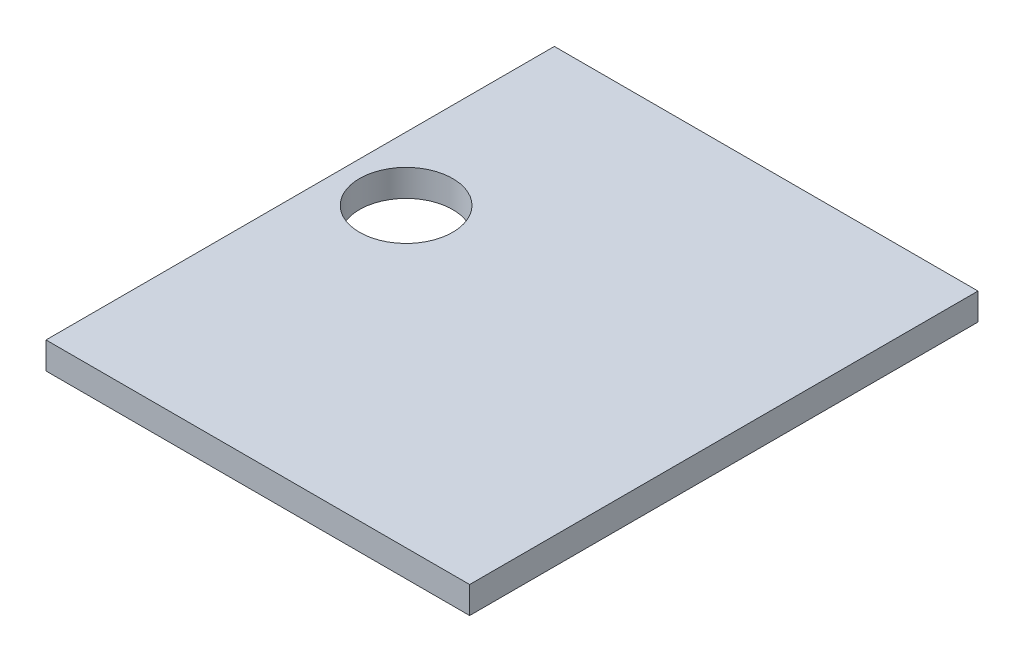
ISO-10303-21;
HEADER;
FILE_DESCRIPTION(('STEP AP214'),'2;1');
FILE_NAME('part.step','',(''),(''),'','','');
FILE_SCHEMA(('AUTOMOTIVE_DESIGN { 1 0 10303 214 1 1 1 1 }'));
ENDSEC;
DATA;
#1=APPLICATION_CONTEXT('core data for automotive mechanical design processes');
#2=APPLICATION_PROTOCOL_DEFINITION('international standard','automotive_design',2000,#1);
#3=PRODUCT_CONTEXT('',#1,'mechanical');
#4=PRODUCT('Part','Part','',(#3));
#5=PRODUCT_RELATED_PRODUCT_CATEGORY('part','',(#4));
#6=PRODUCT_DEFINITION_FORMATION('','',#4);
#7=PRODUCT_DEFINITION_CONTEXT('part definition',#1,'design');
#8=PRODUCT_DEFINITION('design','',#6,#7);
#9=PRODUCT_DEFINITION_SHAPE('','',#8);
#10=(LENGTH_UNIT() NAMED_UNIT(*) SI_UNIT(.MILLI.,.METRE.));
#11=(NAMED_UNIT(*) PLANE_ANGLE_UNIT() SI_UNIT($,.RADIAN.));
#12=(NAMED_UNIT(*) SI_UNIT($,.STERADIAN.) SOLID_ANGLE_UNIT());
#13=UNCERTAINTY_MEASURE_WITH_UNIT(LENGTH_MEASURE(1.E-05),#10,'distance_accuracy_value','');
#14=(GEOMETRIC_REPRESENTATION_CONTEXT(3) GLOBAL_UNCERTAINTY_ASSIGNED_CONTEXT((#13)) GLOBAL_UNIT_ASSIGNED_CONTEXT((#10,
#11,#12)) REPRESENTATION_CONTEXT('',''));
#15=CARTESIAN_POINT('',(0.,0.,0.));
#16=DIRECTION('',(0.,0.,1.));
#17=DIRECTION('',(1.,0.,0.));
#18=AXIS2_PLACEMENT_3D('',#15,#16,#17);
#19=CARTESIAN_POINT('',(0.,6.35,0.));
#20=DIRECTION('',(0.,-1.,0.));
#21=DIRECTION('',(0.,0.,-1.));
#22=AXIS2_PLACEMENT_3D('',#19,#20,#21);
#23=PLANE('',#22);
#24=DIRECTION('',(0.,0.,1.));
#25=VECTOR('',#24,1.);
#26=CARTESIAN_POINT('',(0.,6.35,0.));
#27=LINE('',#26,#25);
#28=CARTESIAN_POINT('',(0.,6.35,-120.));
#29=VERTEX_POINT('',#28);
#30=CARTESIAN_POINT('',(0.,6.35,0.));
#31=VERTEX_POINT('',#30);
#32=EDGE_CURVE('E85',#29,#31,#27,.T.);
#33=ORIENTED_EDGE('',*,*,#32,.T.);
#34=DIRECTION('',(1.,0.,0.));
#35=VECTOR('',#34,1.);
#36=CARTESIAN_POINT('',(0.,6.35,0.));
#37=LINE('',#36,#35);
#38=CARTESIAN_POINT('',(100.,6.35,0.));
#39=VERTEX_POINT('',#38);
#40=EDGE_CURVE('E80',#31,#39,#37,.T.);
#41=ORIENTED_EDGE('',*,*,#40,.T.);
#42=DIRECTION('',(0.,0.,-1.));
#43=VECTOR('',#42,1.);
#44=CARTESIAN_POINT('',(100.,6.35,0.));
#45=LINE('',#44,#43);
#46=CARTESIAN_POINT('',(100.,6.35,-120.));
#47=VERTEX_POINT('',#46);
#48=EDGE_CURVE('E83',#39,#47,#45,.T.);
#49=ORIENTED_EDGE('',*,*,#48,.T.);
#50=DIRECTION('',(-1.,0.,0.));
#51=VECTOR('',#50,1.);
#52=CARTESIAN_POINT('',(0.,6.35,-120.));
#53=LINE('',#52,#51);
#54=EDGE_CURVE('E50',#47,#29,#53,.T.);
#55=ORIENTED_EDGE('',*,*,#54,.T.);
#56=EDGE_LOOP('',(#33,#41,#49,#55));
#57=FACE_BOUND('',#56,.T.);
#58=CARTESIAN_POINT('',(15.,6.35,-70.));
#59=DIRECTION('',(0.,1.,0.));
#60=DIRECTION('',(0.,0.,1.));
#61=AXIS2_PLACEMENT_3D('',#58,#59,#60);
#62=CIRCLE('',#61,11.);
#63=CARTESIAN_POINT('',(15.,6.35,-59.));
#64=VERTEX_POINT('',#63);
#65=EDGE_CURVE('E100',#64,#64,#62,.T.);
#66=ORIENTED_EDGE('',*,*,#65,.F.);
#67=EDGE_LOOP('',(#66));
#68=FACE_BOUND('',#67,.T.);
#69=ADVANCED_FACE('F33',(#57,#68),#23,.F.);
#70=CARTESIAN_POINT('',(0.,0.,0.));
#71=DIRECTION('',(0.,-1.,0.));
#72=DIRECTION('',(0.,0.,-1.));
#73=AXIS2_PLACEMENT_3D('',#70,#71,#72);
#74=PLANE('',#73);
#75=DIRECTION('',(0.,0.,1.));
#76=VECTOR('',#75,1.);
#77=CARTESIAN_POINT('',(0.,0.,0.));
#78=LINE('',#77,#76);
#79=CARTESIAN_POINT('',(0.,0.,-120.));
#80=VERTEX_POINT('',#79);
#81=CARTESIAN_POINT('',(0.,0.,0.));
#82=VERTEX_POINT('',#81);
#83=EDGE_CURVE('E97',#80,#82,#78,.T.);
#84=ORIENTED_EDGE('',*,*,#83,.F.);
#85=DIRECTION('',(-1.,0.,0.));
#86=VECTOR('',#85,1.);
#87=CARTESIAN_POINT('',(0.,0.,-120.));
#88=LINE('',#87,#86);
#89=CARTESIAN_POINT('',(100.,0.,-120.));
#90=VERTEX_POINT('',#89);
#91=EDGE_CURVE('E73',#90,#80,#88,.T.);
#92=ORIENTED_EDGE('',*,*,#91,.F.);
#93=DIRECTION('',(0.,0.,-1.));
#94=VECTOR('',#93,1.);
#95=CARTESIAN_POINT('',(100.,0.,0.));
#96=LINE('',#95,#94);
#97=CARTESIAN_POINT('',(100.,0.,0.));
#98=VERTEX_POINT('',#97);
#99=EDGE_CURVE('E67',#98,#90,#96,.T.);
#100=ORIENTED_EDGE('',*,*,#99,.F.);
#101=DIRECTION('',(1.,0.,0.));
#102=VECTOR('',#101,1.);
#103=CARTESIAN_POINT('',(0.,0.,0.));
#104=LINE('',#103,#102);
#105=EDGE_CURVE('E89',#82,#98,#104,.T.);
#106=ORIENTED_EDGE('',*,*,#105,.F.);
#107=EDGE_LOOP('',(#84,#92,#100,#106));
#108=FACE_BOUND('',#107,.T.);
#109=CARTESIAN_POINT('',(15.,0.,-70.));
#110=DIRECTION('',(0.,1.,0.));
#111=DIRECTION('',(0.,0.,1.));
#112=AXIS2_PLACEMENT_3D('',#109,#110,#111);
#113=CIRCLE('',#112,11.);
#114=CARTESIAN_POINT('',(15.,0.,-59.));
#115=VERTEX_POINT('',#114);
#116=EDGE_CURVE('E112',#115,#115,#113,.T.);
#117=ORIENTED_EDGE('',*,*,#116,.T.);
#118=EDGE_LOOP('',(#117));
#119=FACE_BOUND('',#118,.T.);
#120=ADVANCED_FACE('F108',(#108,#119),#74,.T.);
#121=CARTESIAN_POINT('',(0.,6.35,0.));
#122=DIRECTION('',(1.,0.,0.));
#123=DIRECTION('',(0.,0.,-1.));
#124=AXIS2_PLACEMENT_3D('',#121,#122,#123);
#125=PLANE('',#124);
#126=ORIENTED_EDGE('',*,*,#83,.T.);
#127=DIRECTION('',(0.,-1.,0.));
#128=VECTOR('',#127,1.);
#129=CARTESIAN_POINT('',(0.,6.35,0.));
#130=LINE('',#129,#128);
#131=EDGE_CURVE('E11',#31,#82,#130,.T.);
#132=ORIENTED_EDGE('',*,*,#131,.F.);
#133=ORIENTED_EDGE('',*,*,#32,.F.);
#134=DIRECTION('',(0.,-1.,0.));
#135=VECTOR('',#134,1.);
#136=CARTESIAN_POINT('',(0.,6.35,-120.));
#137=LINE('',#136,#135);
#138=EDGE_CURVE('E93',#29,#80,#137,.T.);
#139=ORIENTED_EDGE('',*,*,#138,.T.);
#140=EDGE_LOOP('',(#126,#132,#133,#139));
#141=FACE_BOUND('',#140,.T.);
#142=ADVANCED_FACE('F35',(#141),#125,.F.);
#143=CARTESIAN_POINT('',(0.,6.35,0.));
#144=DIRECTION('',(0.,0.,-1.));
#145=DIRECTION('',(-1.,0.,0.));
#146=AXIS2_PLACEMENT_3D('',#143,#144,#145);
#147=PLANE('',#146);
#148=ORIENTED_EDGE('',*,*,#105,.T.);
#149=DIRECTION('',(0.,-1.,0.));
#150=VECTOR('',#149,1.);
#151=CARTESIAN_POINT('',(100.,6.35,0.));
#152=LINE('',#151,#150);
#153=EDGE_CURVE('E42',#39,#98,#152,.T.);
#154=ORIENTED_EDGE('',*,*,#153,.F.);
#155=ORIENTED_EDGE('',*,*,#40,.F.);
#156=ORIENTED_EDGE('',*,*,#131,.T.);
#157=EDGE_LOOP('',(#148,#154,#155,#156));
#158=FACE_BOUND('',#157,.T.);
#159=ADVANCED_FACE('F88',(#158),#147,.F.);
#160=CARTESIAN_POINT('',(100.,6.35,0.));
#161=DIRECTION('',(-1.,0.,0.));
#162=DIRECTION('',(0.,0.,1.));
#163=AXIS2_PLACEMENT_3D('',#160,#161,#162);
#164=PLANE('',#163);
#165=ORIENTED_EDGE('',*,*,#99,.T.);
#166=DIRECTION('',(0.,-1.,0.));
#167=VECTOR('',#166,1.);
#168=CARTESIAN_POINT('',(100.,6.35,-120.));
#169=LINE('',#168,#167);
#170=EDGE_CURVE('E90',#47,#90,#169,.T.);
#171=ORIENTED_EDGE('',*,*,#170,.F.);
#172=ORIENTED_EDGE('',*,*,#48,.F.);
#173=ORIENTED_EDGE('',*,*,#153,.T.);
#174=EDGE_LOOP('',(#165,#171,#172,#173));
#175=FACE_BOUND('',#174,.T.);
#176=ADVANCED_FACE('F91',(#175),#164,.F.);
#177=CARTESIAN_POINT('',(0.,6.35,-120.));
#178=DIRECTION('',(0.,0.,1.));
#179=DIRECTION('',(1.,0.,0.));
#180=AXIS2_PLACEMENT_3D('',#177,#178,#179);
#181=PLANE('',#180);
#182=ORIENTED_EDGE('',*,*,#91,.T.);
#183=ORIENTED_EDGE('',*,*,#138,.F.);
#184=ORIENTED_EDGE('',*,*,#54,.F.);
#185=ORIENTED_EDGE('',*,*,#170,.T.);
#186=EDGE_LOOP('',(#182,#183,#184,#185));
#187=FACE_BOUND('',#186,.T.);
#188=ADVANCED_FACE('F105',(#187),#181,.F.);
#189=CARTESIAN_POINT('',(15.,6.35,-70.));
#190=DIRECTION('',(0.,-1.,0.));
#191=DIRECTION('',(0.,0.,-1.));
#192=AXIS2_PLACEMENT_3D('',#189,#190,#191);
#193=CYLINDRICAL_SURFACE('',#192,11.);
#194=ORIENTED_EDGE('',*,*,#65,.T.);
#195=EDGE_LOOP('',(#194));
#196=FACE_BOUND('',#195,.T.);
#197=ORIENTED_EDGE('',*,*,#116,.F.);
#198=EDGE_LOOP('',(#197));
#199=FACE_BOUND('',#198,.T.);
#200=ADVANCED_FACE('F118',(#196,#199),#193,.F.);
#201=CLOSED_SHELL('',(#69,#120,#142,#159,#176,#188,#200));
#202=MANIFOLD_SOLID_BREP('B2',#201);
#203=ADVANCED_BREP_SHAPE_REPRESENTATION('',(#18,#202),#14);
#204=SHAPE_DEFINITION_REPRESENTATION(#9,#203);
ENDSEC;
END-ISO-10303-21;
